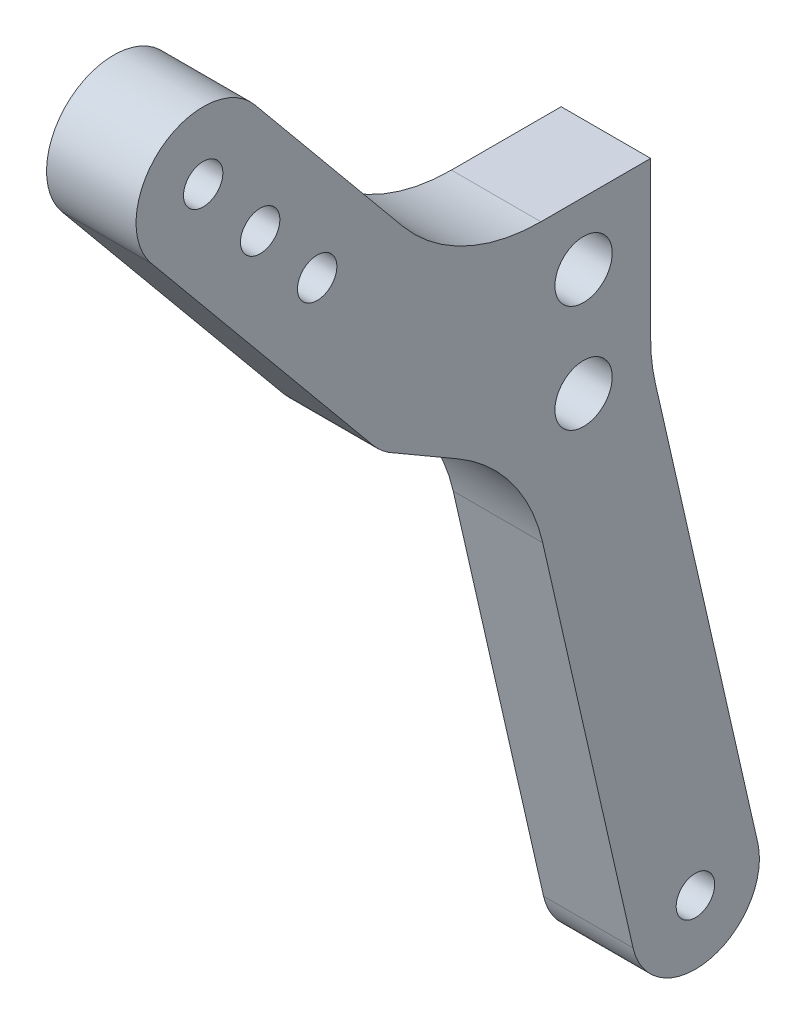
ISO-10303-21;
HEADER;
FILE_DESCRIPTION(('STEP AP214'),'2;1');
FILE_NAME('part.step','',(''),(''),'','','');
FILE_SCHEMA(('AUTOMOTIVE_DESIGN { 1 0 10303 214 1 1 1 1 }'));
ENDSEC;
DATA;
#1=APPLICATION_CONTEXT('core data for automotive mechanical design processes');
#2=APPLICATION_PROTOCOL_DEFINITION('international standard','automotive_design',2000,#1);
#3=PRODUCT_CONTEXT('',#1,'mechanical');
#4=PRODUCT('Part','Part','',(#3));
#5=PRODUCT_RELATED_PRODUCT_CATEGORY('part','',(#4));
#6=PRODUCT_DEFINITION_FORMATION('','',#4);
#7=PRODUCT_DEFINITION_CONTEXT('part definition',#1,'design');
#8=PRODUCT_DEFINITION('design','',#6,#7);
#9=PRODUCT_DEFINITION_SHAPE('','',#8);
#10=(LENGTH_UNIT() NAMED_UNIT(*) SI_UNIT(.MILLI.,.METRE.));
#11=(NAMED_UNIT(*) PLANE_ANGLE_UNIT() SI_UNIT($,.RADIAN.));
#12=(NAMED_UNIT(*) SI_UNIT($,.STERADIAN.) SOLID_ANGLE_UNIT());
#13=UNCERTAINTY_MEASURE_WITH_UNIT(LENGTH_MEASURE(1.E-05),#10,'distance_accuracy_value','');
#14=(GEOMETRIC_REPRESENTATION_CONTEXT(3) GLOBAL_UNCERTAINTY_ASSIGNED_CONTEXT((#13)) GLOBAL_UNIT_ASSIGNED_CONTEXT((#10,
#11,#12)) REPRESENTATION_CONTEXT('',''));
#15=CARTESIAN_POINT('',(0.,0.,0.));
#16=DIRECTION('',(0.,0.,1.));
#17=DIRECTION('',(1.,0.,0.));
#18=AXIS2_PLACEMENT_3D('',#15,#16,#17);
#19=CARTESIAN_POINT('',(-32.5307226607845,0.,12.6104473773552));
#20=DIRECTION('',(1.,0.,0.));
#21=DIRECTION('',(0.,0.,-1.));
#22=AXIS2_PLACEMENT_3D('',#19,#20,#21);
#23=CYLINDRICAL_SURFACE('',#22,3.75);
#24=CARTESIAN_POINT('',(-2.5,0.,12.6104473773552));
#25=DIRECTION('',(1.,0.,0.));
#26=DIRECTION('',(0.,0.,-1.));
#27=AXIS2_PLACEMENT_3D('',#24,#25,#26);
#28=CIRCLE('',#27,3.75);
#29=CARTESIAN_POINT('',(-2.5,-3.30477981303908,14.3827143965511));
#30=VERTEX_POINT('',#29);
#31=CARTESIAN_POINT('',(-2.5,-2.38810472879538,15.5017197277756));
#32=VERTEX_POINT('',#31);
#33=EDGE_CURVE('E205',#30,#32,#28,.F.);
#34=ORIENTED_EDGE('',*,*,#33,.F.);
#35=DIRECTION('',(1.,0.,0.));
#36=VECTOR('',#35,1.);
#37=CARTESIAN_POINT('',(-17.8789757883041,-3.30477981303908,14.3827143965511));
#38=LINE('',#37,#36);
#39=CARTESIAN_POINT('',(2.5,-3.30477981303908,14.3827143965511));
#40=VERTEX_POINT('',#39);
#41=EDGE_CURVE('E168',#30,#40,#38,.T.);
#42=ORIENTED_EDGE('',*,*,#41,.T.);
#43=CARTESIAN_POINT('',(2.5,0.,12.6104473773552));
#44=DIRECTION('',(1.,0.,0.));
#45=DIRECTION('',(0.,0.,-1.));
#46=AXIS2_PLACEMENT_3D('',#43,#44,#45);
#47=CIRCLE('',#46,3.75);
#48=CARTESIAN_POINT('',(2.5,-2.38810472879538,15.5017197277756));
#49=VERTEX_POINT('',#48);
#50=EDGE_CURVE('E196',#49,#40,#47,.T.);
#51=ORIENTED_EDGE('',*,*,#50,.F.);
#52=DIRECTION('',(1.,0.,0.));
#53=VECTOR('',#52,1.);
#54=CARTESIAN_POINT('',(-32.5307226607845,-2.38810472879538,15.5017197277756));
#55=LINE('',#54,#53);
#56=EDGE_CURVE('E202',#32,#49,#55,.T.);
#57=ORIENTED_EDGE('',*,*,#56,.F.);
#58=EDGE_LOOP('',(#34,#42,#51,#57));
#59=FACE_BOUND('',#58,.T.);
#60=ADVANCED_FACE('F33',(#59),#23,.T.);
#61=CARTESIAN_POINT('',(2.5,-3.75,13.));
#62=DIRECTION('',(-1.,0.,0.));
#63=DIRECTION('',(0.,0.,1.));
#64=AXIS2_PLACEMENT_3D('',#61,#62,#63);
#65=PLANE('',#64);
#66=DIRECTION('',(0.,0.974975634519117,0.222311745290359));
#67=VECTOR('',#66,1.);
#68=CARTESIAN_POINT('',(2.5,-32.3653829492016,-5.98553789340585));
#69=LINE('',#68,#67);
#70=CARTESIAN_POINT('',(2.5,-32.3653829492016,-5.98553789340585));
#71=VERTEX_POINT('',#70);
#72=CARTESIAN_POINT('',(2.5,-7.21254123979658,-0.250243654808829));
#73=VERTEX_POINT('',#72);
#74=EDGE_CURVE('E141',#71,#73,#69,.T.);
#75=ORIENTED_EDGE('',*,*,#74,.T.);
#76=CARTESIAN_POINT('',(2.5,-4.98942378689299,-10.));
#77=DIRECTION('',(-1.,0.,0.));
#78=DIRECTION('',(0.,0.,1.));
#79=AXIS2_PLACEMENT_3D('',#76,#77,#78);
#80=CIRCLE('',#79,10.);
#81=CARTESIAN_POINT('',(2.5,-4.98942378689299,0.));
#82=VERTEX_POINT('',#81);
#83=EDGE_CURVE('E41',#73,#82,#80,.T.);
#84=ORIENTED_EDGE('',*,*,#83,.T.);
#85=DIRECTION('',(0.,1.,0.));
#86=VECTOR('',#85,1.);
#87=CARTESIAN_POINT('',(2.5,-3.75,0.));
#88=LINE('',#87,#86);
#89=CARTESIAN_POINT('',(2.5,3.75,0.));
#90=VERTEX_POINT('',#89);
#91=EDGE_CURVE('E226',#82,#90,#88,.T.);
#92=ORIENTED_EDGE('',*,*,#91,.T.);
#93=DIRECTION('',(0.,0.,-1.));
#94=VECTOR('',#93,1.);
#95=CARTESIAN_POINT('',(2.5,3.75,13.));
#96=LINE('',#95,#94);
#97=CARTESIAN_POINT('',(2.5,3.75,6.13369330182128));
#98=VERTEX_POINT('',#97);
#99=EDGE_CURVE('E235',#98,#90,#96,.T.);
#100=ORIENTED_EDGE('',*,*,#99,.F.);
#101=CARTESIAN_POINT('',(2.5,13.75,6.13369330182128));
#102=DIRECTION('',(-1.,0.,0.));
#103=DIRECTION('',(0.,0.,1.));
#104=AXIS2_PLACEMENT_3D('',#101,#102,#103);
#105=CIRCLE('',#104,10.);
#106=CARTESIAN_POINT('',(2.5,7.38172072321232,13.8437529029422));
#107=VERTEX_POINT('',#106);
#108=EDGE_CURVE('E254',#98,#107,#105,.T.);
#109=ORIENTED_EDGE('',*,*,#108,.T.);
#110=DIRECTION('',(0.,0.771005960112091,0.636827927678767));
#111=VECTOR('',#110,1.);
#112=CARTESIAN_POINT('',(2.5,2.38810472879537,9.71917502693489));
#113=LINE('',#112,#111);
#114=CARTESIAN_POINT('',(2.5,17.3881047287954,22.1087276495797));
#115=VERTEX_POINT('',#114);
#116=EDGE_CURVE('E210',#107,#115,#113,.T.);
#117=ORIENTED_EDGE('',*,*,#116,.T.);
#118=CARTESIAN_POINT('',(2.5,15.,25.));
#119=DIRECTION('',(1.,0.,0.));
#120=DIRECTION('',(0.,0.,-1.));
#121=AXIS2_PLACEMENT_3D('',#118,#119,#120);
#122=CIRCLE('',#121,3.75);
#123=CARTESIAN_POINT('',(2.5,12.6118952712046,27.8912723504203));
#124=VERTEX_POINT('',#123);
#125=EDGE_CURVE('E212',#115,#124,#122,.T.);
#126=ORIENTED_EDGE('',*,*,#125,.T.);
#127=DIRECTION('',(0.,0.771005960112091,0.636827927678767));
#128=VECTOR('',#127,1.);
#129=CARTESIAN_POINT('',(2.5,-2.38810472879538,15.5017197277756));
#130=LINE('',#129,#128);
#131=EDGE_CURVE('E215',#49,#124,#130,.T.);
#132=ORIENTED_EDGE('',*,*,#131,.F.);
#133=ORIENTED_EDGE('',*,*,#50,.T.);
#134=DIRECTION('',(0.,0.501941959665057,0.864901306004102));
#135=VECTOR('',#134,1.);
#136=CARTESIAN_POINT('',(2.5,-8.75,5.));
#137=LINE('',#136,#135);
#138=CARTESIAN_POINT('',(2.5,-5.40718089693601,10.7600456632571));
#139=VERTEX_POINT('',#138);
#140=EDGE_CURVE('E162',#139,#40,#137,.T.);
#141=ORIENTED_EDGE('',*,*,#140,.F.);
#142=CARTESIAN_POINT('',(2.5,-14.056193956977,15.7794652599077));
#143=DIRECTION('',(-1.,0.,0.));
#144=DIRECTION('',(0.,0.,1.));
#145=AXIS2_PLACEMENT_3D('',#142,#143,#144);
#146=CIRCLE('',#145,10.);
#147=CARTESIAN_POINT('',(2.5,-11.8330765040735,6.02970891471654));
#148=VERTEX_POINT('',#147);
#149=EDGE_CURVE('E250',#139,#148,#146,.T.);
#150=ORIENTED_EDGE('',*,*,#149,.T.);
#151=DIRECTION('',(0.,-0.974975634519117,-0.222311745290359));
#152=VECTOR('',#151,1.);
#153=CARTESIAN_POINT('',(2.5,-33.9549119280277,0.985537893405839));
#154=LINE('',#153,#152);
#155=CARTESIAN_POINT('',(2.5,-33.9549119280277,0.985537893405839));
#156=VERTEX_POINT('',#155);
#157=EDGE_CURVE('E138',#148,#156,#154,.T.);
#158=ORIENTED_EDGE('',*,*,#157,.T.);
#159=CARTESIAN_POINT('',(2.5,-33.1601474386147,-2.50000000000001));
#160=DIRECTION('',(1.,0.,0.));
#161=DIRECTION('',(0.,0.,-1.));
#162=AXIS2_PLACEMENT_3D('',#159,#160,#161);
#163=CIRCLE('',#162,3.575);
#164=EDGE_CURVE('E133',#156,#71,#163,.T.);
#165=ORIENTED_EDGE('',*,*,#164,.T.);
#166=EDGE_LOOP('',(#75,#84,#92,#100,#109,#117,#126,#132,#133,#141,#150,#158,#165));
#167=FACE_BOUND('',#166,.T.);
#168=CARTESIAN_POINT('',(2.5,15.,25.));
#169=DIRECTION('',(1.,0.,0.));
#170=DIRECTION('',(0.,0.,-1.));
#171=AXIS2_PLACEMENT_3D('',#168,#169,#170);
#172=CIRCLE('',#171,1.1);
#173=CARTESIAN_POINT('',(2.5,15.,23.9));
#174=VERTEX_POINT('',#173);
#175=EDGE_CURVE('E190',#174,#174,#172,.T.);
#176=ORIENTED_EDGE('',*,*,#175,.F.);
#177=EDGE_LOOP('',(#176));
#178=FACE_BOUND('',#177,.T.);
#179=CARTESIAN_POINT('',(2.5,11.1449701994395,21.8158603616062));
#180=DIRECTION('',(1.,0.,0.));
#181=DIRECTION('',(0.,0.,-1.));
#182=AXIS2_PLACEMENT_3D('',#179,#180,#181);
#183=CIRCLE('',#182,1.1);
#184=CARTESIAN_POINT('',(2.5,11.1449701994395,20.7158603616062));
#185=VERTEX_POINT('',#184);
#186=EDGE_CURVE('E184',#185,#185,#183,.T.);
#187=ORIENTED_EDGE('',*,*,#186,.F.);
#188=EDGE_LOOP('',(#187));
#189=FACE_BOUND('',#188,.T.);
#190=CARTESIAN_POINT('',(2.5,7.28994039887909,18.6317207232123));
#191=DIRECTION('',(1.,0.,0.));
#192=DIRECTION('',(0.,0.,-1.));
#193=AXIS2_PLACEMENT_3D('',#190,#191,#192);
#194=CIRCLE('',#193,1.1);
#195=CARTESIAN_POINT('',(2.5,7.28994039887909,17.5317207232123));
#196=VERTEX_POINT('',#195);
#197=EDGE_CURVE('E178',#196,#196,#194,.T.);
#198=ORIENTED_EDGE('',*,*,#197,.F.);
#199=EDGE_LOOP('',(#198));
#200=FACE_BOUND('',#199,.T.);
#201=CARTESIAN_POINT('',(2.5,0.249999999999999,3.74999999999999));
#202=DIRECTION('',(1.,0.,0.));
#203=DIRECTION('',(0.,0.,-1.));
#204=AXIS2_PLACEMENT_3D('',#201,#202,#203);
#205=CIRCLE('',#204,1.6);
#206=CARTESIAN_POINT('',(2.5,0.249999999999999,2.14999999999999));
#207=VERTEX_POINT('',#206);
#208=EDGE_CURVE('E174',#207,#207,#205,.T.);
#209=ORIENTED_EDGE('',*,*,#208,.F.);
#210=EDGE_LOOP('',(#209));
#211=FACE_BOUND('',#210,.T.);
#212=CARTESIAN_POINT('',(2.5,-5.75,3.74999999999999));
#213=DIRECTION('',(1.,0.,0.));
#214=DIRECTION('',(0.,0.,-1.));
#215=AXIS2_PLACEMENT_3D('',#212,#213,#214);
#216=CIRCLE('',#215,1.6);
#217=CARTESIAN_POINT('',(2.5,-5.75,2.14999999999999));
#218=VERTEX_POINT('',#217);
#219=EDGE_CURVE('E163',#218,#218,#216,.T.);
#220=ORIENTED_EDGE('',*,*,#219,.F.);
#221=EDGE_LOOP('',(#220));
#222=FACE_BOUND('',#221,.T.);
#223=CARTESIAN_POINT('',(2.5,-33.1601474386147,-2.50000000000001));
#224=DIRECTION('',(1.,0.,0.));
#225=DIRECTION('',(0.,0.,-1.));
#226=AXIS2_PLACEMENT_3D('',#223,#224,#225);
#227=CIRCLE('',#226,1.075);
#228=CARTESIAN_POINT('',(2.5,-33.1601474386147,-3.57500000000001));
#229=VERTEX_POINT('',#228);
#230=EDGE_CURVE('E150',#229,#229,#227,.T.);
#231=ORIENTED_EDGE('',*,*,#230,.F.);
#232=EDGE_LOOP('',(#231));
#233=FACE_BOUND('',#232,.T.);
#234=ADVANCED_FACE('F146',(#167,#178,#189,#200,#211,#222,#233),#65,.F.);
#235=CARTESIAN_POINT('',(-2.5,3.75,13.));
#236=DIRECTION('',(0.,-1.,0.));
#237=DIRECTION('',(0.,0.,-1.));
#238=AXIS2_PLACEMENT_3D('',#235,#236,#237);
#239=PLANE('',#238);
#240=DIRECTION('',(0.,0.,-1.));
#241=VECTOR('',#240,1.);
#242=CARTESIAN_POINT('',(-2.5,3.75,13.));
#243=LINE('',#242,#241);
#244=CARTESIAN_POINT('',(-2.5,3.75,6.13369330182128));
#245=VERTEX_POINT('',#244);
#246=CARTESIAN_POINT('',(-2.5,3.75,0.));
#247=VERTEX_POINT('',#246);
#248=EDGE_CURVE('E233',#245,#247,#243,.T.);
#249=ORIENTED_EDGE('',*,*,#248,.F.);
#250=DIRECTION('',(1.,0.,0.));
#251=VECTOR('',#250,1.);
#252=CARTESIAN_POINT('',(-2.5,3.75,6.13369330182128));
#253=LINE('',#252,#251);
#254=EDGE_CURVE('E243',#245,#98,#253,.T.);
#255=ORIENTED_EDGE('',*,*,#254,.T.);
#256=ORIENTED_EDGE('',*,*,#99,.T.);
#257=DIRECTION('',(-1.,0.,0.));
#258=VECTOR('',#257,1.);
#259=CARTESIAN_POINT('',(-2.5,3.75,0.));
#260=LINE('',#259,#258);
#261=EDGE_CURVE('E228',#90,#247,#260,.T.);
#262=ORIENTED_EDGE('',*,*,#261,.T.);
#263=EDGE_LOOP('',(#249,#255,#256,#262));
#264=FACE_BOUND('',#263,.T.);
#265=ADVANCED_FACE('F267',(#264),#239,.F.);
#266=CARTESIAN_POINT('',(-2.5,-3.75,13.));
#267=DIRECTION('',(1.,0.,0.));
#268=DIRECTION('',(0.,0.,-1.));
#269=AXIS2_PLACEMENT_3D('',#266,#267,#268);
#270=PLANE('',#269);
#271=DIRECTION('',(0.,-1.,0.));
#272=VECTOR('',#271,1.);
#273=CARTESIAN_POINT('',(-2.5,-3.75,0.));
#274=LINE('',#273,#272);
#275=CARTESIAN_POINT('',(-2.5,-4.98942378689299,0.));
#276=VERTEX_POINT('',#275);
#277=EDGE_CURVE('E231',#247,#276,#274,.T.);
#278=ORIENTED_EDGE('',*,*,#277,.T.);
#279=CARTESIAN_POINT('',(-2.50000000000001,-4.98942378689299,-10.));
#280=DIRECTION('',(1.,0.,0.));
#281=DIRECTION('',(0.,0.,-1.));
#282=AXIS2_PLACEMENT_3D('',#279,#280,#281);
#283=CIRCLE('',#282,10.);
#284=CARTESIAN_POINT('',(-2.5,-7.21254123979658,-0.25024365480883));
#285=VERTEX_POINT('',#284);
#286=EDGE_CURVE('E11',#276,#285,#283,.T.);
#287=ORIENTED_EDGE('',*,*,#286,.T.);
#288=DIRECTION('',(0.,-0.974975634519117,-0.222311745290359));
#289=VECTOR('',#288,1.);
#290=CARTESIAN_POINT('',(-2.5,-32.3653829492016,-5.98553789340585));
#291=LINE('',#290,#289);
#292=CARTESIAN_POINT('',(-2.5,-32.3653829492016,-5.98553789340585));
#293=VERTEX_POINT('',#292);
#294=EDGE_CURVE('E300',#285,#293,#291,.T.);
#295=ORIENTED_EDGE('',*,*,#294,.T.);
#296=CARTESIAN_POINT('',(-2.5,-33.1601474386147,-2.50000000000001));
#297=DIRECTION('',(1.,0.,0.));
#298=DIRECTION('',(0.,0.,-1.));
#299=AXIS2_PLACEMENT_3D('',#296,#297,#298);
#300=CIRCLE('',#299,3.575);
#301=CARTESIAN_POINT('',(-2.5,-33.9549119280277,0.985537893405839));
#302=VERTEX_POINT('',#301);
#303=EDGE_CURVE('E134',#293,#302,#300,.F.);
#304=ORIENTED_EDGE('',*,*,#303,.T.);
#305=DIRECTION('',(0.,0.974975634519117,0.222311745290359));
#306=VECTOR('',#305,1.);
#307=CARTESIAN_POINT('',(-2.5,-33.9549119280277,0.985537893405839));
#308=LINE('',#307,#306);
#309=CARTESIAN_POINT('',(-2.5,-11.8330765040734,6.02970891471655));
#310=VERTEX_POINT('',#309);
#311=EDGE_CURVE('E157',#302,#310,#308,.T.);
#312=ORIENTED_EDGE('',*,*,#311,.T.);
#313=CARTESIAN_POINT('',(-2.5,-14.056193956977,15.7794652599077));
#314=DIRECTION('',(1.,0.,0.));
#315=DIRECTION('',(0.,0.,-1.));
#316=AXIS2_PLACEMENT_3D('',#313,#314,#315);
#317=CIRCLE('',#316,10.);
#318=CARTESIAN_POINT('',(-2.5,-5.40718089693601,10.7600456632571));
#319=VERTEX_POINT('',#318);
#320=EDGE_CURVE('E252',#310,#319,#317,.T.);
#321=ORIENTED_EDGE('',*,*,#320,.T.);
#322=DIRECTION('',(0.,-0.501941959665057,-0.864901306004103));
#323=VECTOR('',#322,1.);
#324=CARTESIAN_POINT('',(-2.5,-8.75,5.));
#325=LINE('',#324,#323);
#326=EDGE_CURVE('E171',#30,#319,#325,.T.);
#327=ORIENTED_EDGE('',*,*,#326,.F.);
#328=ORIENTED_EDGE('',*,*,#33,.T.);
#329=DIRECTION('',(0.,-0.771005960112091,-0.636827927678767));
#330=VECTOR('',#329,1.);
#331=CARTESIAN_POINT('',(-2.5,-2.38810472879538,15.5017197277756));
#332=LINE('',#331,#330);
#333=CARTESIAN_POINT('',(-2.5,12.6118952712046,27.8912723504203));
#334=VERTEX_POINT('',#333);
#335=EDGE_CURVE('E201',#334,#32,#332,.T.);
#336=ORIENTED_EDGE('',*,*,#335,.F.);
#337=CARTESIAN_POINT('',(-2.5,15.,25.));
#338=DIRECTION('',(1.,0.,0.));
#339=DIRECTION('',(0.,0.,-1.));
#340=AXIS2_PLACEMENT_3D('',#337,#338,#339);
#341=CIRCLE('',#340,3.75);
#342=CARTESIAN_POINT('',(-2.5,17.3881047287954,22.1087276495797));
#343=VERTEX_POINT('',#342);
#344=EDGE_CURVE('E199',#334,#343,#341,.F.);
#345=ORIENTED_EDGE('',*,*,#344,.T.);
#346=DIRECTION('',(0.,-0.771005960112091,-0.636827927678767));
#347=VECTOR('',#346,1.);
#348=CARTESIAN_POINT('',(-2.5,2.38810472879537,9.71917502693489));
#349=LINE('',#348,#347);
#350=CARTESIAN_POINT('',(-2.5,7.38172072321233,13.8437529029422));
#351=VERTEX_POINT('',#350);
#352=EDGE_CURVE('E207',#343,#351,#349,.T.);
#353=ORIENTED_EDGE('',*,*,#352,.T.);
#354=CARTESIAN_POINT('',(-2.5,13.75,6.13369330182128));
#355=DIRECTION('',(1.,0.,0.));
#356=DIRECTION('',(0.,0.,-1.));
#357=AXIS2_PLACEMENT_3D('',#354,#355,#356);
#358=CIRCLE('',#357,10.);
#359=EDGE_CURVE('E256',#351,#245,#358,.T.);
#360=ORIENTED_EDGE('',*,*,#359,.T.);
#361=ORIENTED_EDGE('',*,*,#248,.T.);
#362=EDGE_LOOP('',(#278,#287,#295,#304,#312,#321,#327,#328,#336,#345,#353,#360,#361));
#363=FACE_BOUND('',#362,.T.);
#364=CARTESIAN_POINT('',(-2.5,15.,25.));
#365=DIRECTION('',(1.,0.,0.));
#366=DIRECTION('',(0.,0.,-1.));
#367=AXIS2_PLACEMENT_3D('',#364,#365,#366);
#368=CIRCLE('',#367,1.1);
#369=CARTESIAN_POINT('',(-2.5,15.,23.9));
#370=VERTEX_POINT('',#369);
#371=EDGE_CURVE('E193',#370,#370,#368,.T.);
#372=ORIENTED_EDGE('',*,*,#371,.T.);
#373=EDGE_LOOP('',(#372));
#374=FACE_BOUND('',#373,.T.);
#375=CARTESIAN_POINT('',(-2.5,11.1449701994395,21.8158603616062));
#376=DIRECTION('',(1.,0.,0.));
#377=DIRECTION('',(0.,0.,-1.));
#378=AXIS2_PLACEMENT_3D('',#375,#376,#377);
#379=CIRCLE('',#378,1.1);
#380=CARTESIAN_POINT('',(-2.5,11.1449701994395,20.7158603616062));
#381=VERTEX_POINT('',#380);
#382=EDGE_CURVE('E187',#381,#381,#379,.T.);
#383=ORIENTED_EDGE('',*,*,#382,.T.);
#384=EDGE_LOOP('',(#383));
#385=FACE_BOUND('',#384,.T.);
#386=CARTESIAN_POINT('',(-2.5,7.28994039887909,18.6317207232123));
#387=DIRECTION('',(1.,0.,0.));
#388=DIRECTION('',(0.,0.,-1.));
#389=AXIS2_PLACEMENT_3D('',#386,#387,#388);
#390=CIRCLE('',#389,1.1);
#391=CARTESIAN_POINT('',(-2.5,7.28994039887909,17.5317207232123));
#392=VERTEX_POINT('',#391);
#393=EDGE_CURVE('E181',#392,#392,#390,.T.);
#394=ORIENTED_EDGE('',*,*,#393,.T.);
#395=EDGE_LOOP('',(#394));
#396=FACE_BOUND('',#395,.T.);
#397=CARTESIAN_POINT('',(-2.5,0.249999999999999,3.74999999999999));
#398=DIRECTION('',(1.,0.,0.));
#399=DIRECTION('',(0.,0.,-1.));
#400=AXIS2_PLACEMENT_3D('',#397,#398,#399);
#401=CIRCLE('',#400,1.6);
#402=CARTESIAN_POINT('',(-2.5,0.249999999999999,2.14999999999999));
#403=VERTEX_POINT('',#402);
#404=EDGE_CURVE('E175',#403,#403,#401,.T.);
#405=ORIENTED_EDGE('',*,*,#404,.T.);
#406=EDGE_LOOP('',(#405));
#407=FACE_BOUND('',#406,.T.);
#408=CARTESIAN_POINT('',(-2.5,-5.75,3.74999999999999));
#409=DIRECTION('',(1.,0.,0.));
#410=DIRECTION('',(0.,0.,-1.));
#411=AXIS2_PLACEMENT_3D('',#408,#409,#410);
#412=CIRCLE('',#411,1.6);
#413=CARTESIAN_POINT('',(-2.5,-5.75,2.14999999999999));
#414=VERTEX_POINT('',#413);
#415=EDGE_CURVE('E159',#414,#414,#412,.T.);
#416=ORIENTED_EDGE('',*,*,#415,.T.);
#417=EDGE_LOOP('',(#416));
#418=FACE_BOUND('',#417,.T.);
#419=CARTESIAN_POINT('',(-2.5,-33.1601474386147,-2.50000000000001));
#420=DIRECTION('',(1.,0.,0.));
#421=DIRECTION('',(0.,0.,-1.));
#422=AXIS2_PLACEMENT_3D('',#419,#420,#421);
#423=CIRCLE('',#422,1.075);
#424=CARTESIAN_POINT('',(-2.5,-33.1601474386147,-3.57500000000001));
#425=VERTEX_POINT('',#424);
#426=EDGE_CURVE('E166',#425,#425,#423,.F.);
#427=ORIENTED_EDGE('',*,*,#426,.F.);
#428=EDGE_LOOP('',(#427));
#429=FACE_BOUND('',#428,.T.);
#430=ADVANCED_FACE('F260',(#363,#374,#385,#396,#407,#418,#429),#270,.F.);
#431=CARTESIAN_POINT('',(0.,0.,0.));
#432=DIRECTION('',(0.,0.,-1.));
#433=DIRECTION('',(-1.,0.,0.));
#434=AXIS2_PLACEMENT_3D('',#431,#432,#433);
#435=PLANE('',#434);
#436=ORIENTED_EDGE('',*,*,#91,.F.);
#437=DIRECTION('',(1.,0.,0.));
#438=VECTOR('',#437,1.);
#439=CARTESIAN_POINT('',(-2.50000000000002,-4.98942378689299,0.));
#440=LINE('',#439,#438);
#441=EDGE_CURVE('E54',#82,#276,#440,.F.);
#442=ORIENTED_EDGE('',*,*,#441,.T.);
#443=ORIENTED_EDGE('',*,*,#277,.F.);
#444=ORIENTED_EDGE('',*,*,#261,.F.);
#445=EDGE_LOOP('',(#436,#442,#443,#444));
#446=FACE_BOUND('',#445,.T.);
#447=ADVANCED_FACE('F310',(#446),#435,.T.);
#448=CARTESIAN_POINT('',(-32.5307226607845,2.38810472879537,9.71917502693489));
#449=DIRECTION('',(0.,0.636827927678767,-0.771005960112091));
#450=DIRECTION('',(0.,0.771005960112091,0.636827927678767));
#451=AXIS2_PLACEMENT_3D('',#448,#449,#450);
#452=PLANE('',#451);
#453=ORIENTED_EDGE('',*,*,#116,.F.);
#454=DIRECTION('',(1.,0.,0.));
#455=VECTOR('',#454,1.);
#456=CARTESIAN_POINT('',(-32.5307226607845,7.38172072321233,13.8437529029422));
#457=LINE('',#456,#455);
#458=EDGE_CURVE('E246',#107,#351,#457,.F.);
#459=ORIENTED_EDGE('',*,*,#458,.T.);
#460=ORIENTED_EDGE('',*,*,#352,.F.);
#461=DIRECTION('',(1.,0.,0.));
#462=VECTOR('',#461,1.);
#463=CARTESIAN_POINT('',(-32.5307226607845,17.3881047287954,22.1087276495797));
#464=LINE('',#463,#462);
#465=EDGE_CURVE('E218',#343,#115,#464,.T.);
#466=ORIENTED_EDGE('',*,*,#465,.T.);
#467=EDGE_LOOP('',(#453,#459,#460,#466));
#468=FACE_BOUND('',#467,.T.);
#469=ADVANCED_FACE('F273',(#468),#452,.T.);
#470=CARTESIAN_POINT('',(-32.5307226607845,-2.38810472879538,15.5017197277756));
#471=DIRECTION('',(0.,0.636827927678767,-0.771005960112091));
#472=DIRECTION('',(0.,0.771005960112091,0.636827927678767));
#473=AXIS2_PLACEMENT_3D('',#470,#471,#472);
#474=PLANE('',#473);
#475=DIRECTION('',(1.,0.,0.));
#476=VECTOR('',#475,1.);
#477=CARTESIAN_POINT('',(-32.5307226607845,12.6118952712046,27.8912723504203));
#478=LINE('',#477,#476);
#479=EDGE_CURVE('E220',#334,#124,#478,.T.);
#480=ORIENTED_EDGE('',*,*,#479,.F.);
#481=ORIENTED_EDGE('',*,*,#335,.T.);
#482=ORIENTED_EDGE('',*,*,#56,.T.);
#483=ORIENTED_EDGE('',*,*,#131,.T.);
#484=EDGE_LOOP('',(#480,#481,#482,#483));
#485=FACE_BOUND('',#484,.T.);
#486=ADVANCED_FACE('F327',(#485),#474,.F.);
#487=CARTESIAN_POINT('',(-32.5307226607845,15.,25.));
#488=DIRECTION('',(1.,0.,0.));
#489=DIRECTION('',(0.,0.,-1.));
#490=AXIS2_PLACEMENT_3D('',#487,#488,#489);
#491=CYLINDRICAL_SURFACE('',#490,3.75);
#492=ORIENTED_EDGE('',*,*,#344,.F.);
#493=ORIENTED_EDGE('',*,*,#479,.T.);
#494=ORIENTED_EDGE('',*,*,#125,.F.);
#495=ORIENTED_EDGE('',*,*,#465,.F.);
#496=EDGE_LOOP('',(#492,#493,#494,#495));
#497=FACE_BOUND('',#496,.T.);
#498=ADVANCED_FACE('F278',(#497),#491,.T.);
#499=CARTESIAN_POINT('',(-2.5,15.,25.));
#500=DIRECTION('',(1.,0.,0.));
#501=DIRECTION('',(0.,0.,-1.));
#502=AXIS2_PLACEMENT_3D('',#499,#500,#501);
#503=CYLINDRICAL_SURFACE('',#502,1.1);
#504=ORIENTED_EDGE('',*,*,#371,.F.);
#505=EDGE_LOOP('',(#504));
#506=FACE_BOUND('',#505,.T.);
#507=ORIENTED_EDGE('',*,*,#175,.T.);
#508=EDGE_LOOP('',(#507));
#509=FACE_BOUND('',#508,.T.);
#510=ADVANCED_FACE('F330',(#506,#509),#503,.F.);
#511=CARTESIAN_POINT('',(-2.5,11.1449701994395,21.8158603616062));
#512=DIRECTION('',(1.,0.,0.));
#513=DIRECTION('',(0.,0.,-1.));
#514=AXIS2_PLACEMENT_3D('',#511,#512,#513);
#515=CYLINDRICAL_SURFACE('',#514,1.1);
#516=ORIENTED_EDGE('',*,*,#382,.F.);
#517=EDGE_LOOP('',(#516));
#518=FACE_BOUND('',#517,.T.);
#519=ORIENTED_EDGE('',*,*,#186,.T.);
#520=EDGE_LOOP('',(#519));
#521=FACE_BOUND('',#520,.T.);
#522=ADVANCED_FACE('F335',(#518,#521),#515,.F.);
#523=CARTESIAN_POINT('',(-2.5,7.28994039887909,18.6317207232123));
#524=DIRECTION('',(1.,0.,0.));
#525=DIRECTION('',(0.,0.,-1.));
#526=AXIS2_PLACEMENT_3D('',#523,#524,#525);
#527=CYLINDRICAL_SURFACE('',#526,1.1);
#528=ORIENTED_EDGE('',*,*,#393,.F.);
#529=EDGE_LOOP('',(#528));
#530=FACE_BOUND('',#529,.T.);
#531=ORIENTED_EDGE('',*,*,#197,.T.);
#532=EDGE_LOOP('',(#531));
#533=FACE_BOUND('',#532,.T.);
#534=ADVANCED_FACE('F339',(#530,#533),#527,.F.);
#535=CARTESIAN_POINT('',(-2.5,0.249999999999999,3.74999999999999));
#536=DIRECTION('',(1.,0.,0.));
#537=DIRECTION('',(0.,0.,-1.));
#538=AXIS2_PLACEMENT_3D('',#535,#536,#537);
#539=CYLINDRICAL_SURFACE('',#538,1.6);
#540=ORIENTED_EDGE('',*,*,#404,.F.);
#541=EDGE_LOOP('',(#540));
#542=FACE_BOUND('',#541,.T.);
#543=ORIENTED_EDGE('',*,*,#208,.T.);
#544=EDGE_LOOP('',(#543));
#545=FACE_BOUND('',#544,.T.);
#546=ADVANCED_FACE('F343',(#542,#545),#539,.F.);
#547=CARTESIAN_POINT('',(-17.8789757883041,-8.75,5.));
#548=DIRECTION('',(0.,0.864901306004102,-0.501941959665057));
#549=DIRECTION('',(0.,0.501941959665057,0.864901306004103));
#550=AXIS2_PLACEMENT_3D('',#547,#548,#549);
#551=PLANE('',#550);
#552=ORIENTED_EDGE('',*,*,#326,.T.);
#553=DIRECTION('',(1.,0.,0.));
#554=VECTOR('',#553,1.);
#555=CARTESIAN_POINT('',(-17.8789757883041,-5.40718089693601,10.7600456632571));
#556=LINE('',#555,#554);
#557=EDGE_CURVE('E238',#319,#139,#556,.T.);
#558=ORIENTED_EDGE('',*,*,#557,.T.);
#559=ORIENTED_EDGE('',*,*,#140,.T.);
#560=ORIENTED_EDGE('',*,*,#41,.F.);
#561=EDGE_LOOP('',(#552,#558,#559,#560));
#562=FACE_BOUND('',#561,.T.);
#563=ADVANCED_FACE('F289',(#562),#551,.F.);
#564=CARTESIAN_POINT('',(-2.5,-5.75,3.74999999999999));
#565=DIRECTION('',(1.,0.,0.));
#566=DIRECTION('',(0.,0.,-1.));
#567=AXIS2_PLACEMENT_3D('',#564,#565,#566);
#568=CYLINDRICAL_SURFACE('',#567,1.6);
#569=ORIENTED_EDGE('',*,*,#415,.F.);
#570=EDGE_LOOP('',(#569));
#571=FACE_BOUND('',#570,.T.);
#572=ORIENTED_EDGE('',*,*,#219,.T.);
#573=EDGE_LOOP('',(#572));
#574=FACE_BOUND('',#573,.T.);
#575=ADVANCED_FACE('F350',(#571,#574),#568,.F.);
#576=CARTESIAN_POINT('',(-39.5670175625013,-33.9549119280277,0.985537893405839));
#577=DIRECTION('',(0.,-0.222311745290359,0.974975634519117));
#578=DIRECTION('',(0.,-0.974975634519117,-0.222311745290359));
#579=AXIS2_PLACEMENT_3D('',#576,#577,#578);
#580=PLANE('',#579);
#581=ORIENTED_EDGE('',*,*,#157,.F.);
#582=DIRECTION('',(1.,0.,0.));
#583=VECTOR('',#582,1.);
#584=CARTESIAN_POINT('',(-39.5670175625013,-11.8330765040735,6.02970891471655));
#585=LINE('',#584,#583);
#586=EDGE_CURVE('E241',#148,#310,#585,.F.);
#587=ORIENTED_EDGE('',*,*,#586,.T.);
#588=ORIENTED_EDGE('',*,*,#311,.F.);
#589=DIRECTION('',(1.,0.,0.));
#590=VECTOR('',#589,1.);
#591=CARTESIAN_POINT('',(-39.5670175625013,-33.9549119280277,0.985537893405839));
#592=LINE('',#591,#590);
#593=EDGE_CURVE('E137',#302,#156,#592,.T.);
#594=ORIENTED_EDGE('',*,*,#593,.T.);
#595=EDGE_LOOP('',(#581,#587,#588,#594));
#596=FACE_BOUND('',#595,.T.);
#597=ADVANCED_FACE('F298',(#596),#580,.T.);
#598=CARTESIAN_POINT('',(-39.5670175625013,-32.3653829492016,-5.98553789340585));
#599=DIRECTION('',(0.,0.222311745290359,-0.974975634519117));
#600=DIRECTION('',(0.,0.974975634519117,0.222311745290359));
#601=AXIS2_PLACEMENT_3D('',#598,#599,#600);
#602=PLANE('',#601);
#603=ORIENTED_EDGE('',*,*,#294,.F.);
#604=DIRECTION('',(1.,0.,0.));
#605=VECTOR('',#604,1.);
#606=CARTESIAN_POINT('',(2.49999999999999,-7.21254123979658,-0.25024365480883));
#607=LINE('',#606,#605);
#608=EDGE_CURVE('E144',#285,#73,#607,.T.);
#609=ORIENTED_EDGE('',*,*,#608,.T.);
#610=ORIENTED_EDGE('',*,*,#74,.F.);
#611=DIRECTION('',(1.,0.,0.));
#612=VECTOR('',#611,1.);
#613=CARTESIAN_POINT('',(-39.5670175625013,-32.3653829492016,-5.98553789340585));
#614=LINE('',#613,#612);
#615=EDGE_CURVE('E128',#293,#71,#614,.T.);
#616=ORIENTED_EDGE('',*,*,#615,.F.);
#617=EDGE_LOOP('',(#603,#609,#610,#616));
#618=FACE_BOUND('',#617,.T.);
#619=ADVANCED_FACE('F142',(#618),#602,.T.);
#620=CARTESIAN_POINT('',(-39.5670175625013,-33.1601474386147,-2.50000000000001));
#621=DIRECTION('',(1.,0.,0.));
#622=DIRECTION('',(0.,0.,-1.));
#623=AXIS2_PLACEMENT_3D('',#620,#621,#622);
#624=CYLINDRICAL_SURFACE('',#623,3.575);
#625=ORIENTED_EDGE('',*,*,#303,.F.);
#626=ORIENTED_EDGE('',*,*,#615,.T.);
#627=ORIENTED_EDGE('',*,*,#164,.F.);
#628=ORIENTED_EDGE('',*,*,#593,.F.);
#629=EDGE_LOOP('',(#625,#626,#627,#628));
#630=FACE_BOUND('',#629,.T.);
#631=ADVANCED_FACE('F130',(#630),#624,.T.);
#632=CARTESIAN_POINT('',(-39.5670175625013,-33.1601474386147,-2.50000000000001));
#633=DIRECTION('',(1.,0.,0.));
#634=DIRECTION('',(0.,0.,-1.));
#635=AXIS2_PLACEMENT_3D('',#632,#633,#634);
#636=CYLINDRICAL_SURFACE('',#635,1.075);
#637=ORIENTED_EDGE('',*,*,#426,.T.);
#638=EDGE_LOOP('',(#637));
#639=FACE_BOUND('',#638,.T.);
#640=ORIENTED_EDGE('',*,*,#230,.T.);
#641=EDGE_LOOP('',(#640));
#642=FACE_BOUND('',#641,.T.);
#643=ADVANCED_FACE('F306',(#639,#642),#636,.F.);
#644=CARTESIAN_POINT('',(-17.8789757883041,-14.056193956977,15.7794652599077));
#645=DIRECTION('',(1.,0.,0.));
#646=DIRECTION('',(0.,0.,-1.));
#647=AXIS2_PLACEMENT_3D('',#644,#645,#646);
#648=CYLINDRICAL_SURFACE('',#647,10.);
#649=ORIENTED_EDGE('',*,*,#320,.F.);
#650=ORIENTED_EDGE('',*,*,#586,.F.);
#651=ORIENTED_EDGE('',*,*,#149,.F.);
#652=ORIENTED_EDGE('',*,*,#557,.F.);
#653=EDGE_LOOP('',(#649,#650,#651,#652));
#654=FACE_BOUND('',#653,.T.);
#655=ADVANCED_FACE('F296',(#654),#648,.F.);
#656=CARTESIAN_POINT('',(-2.5,13.75,6.13369330182128));
#657=DIRECTION('',(1.,0.,0.));
#658=DIRECTION('',(0.,0.,-1.));
#659=AXIS2_PLACEMENT_3D('',#656,#657,#658);
#660=CYLINDRICAL_SURFACE('',#659,10.);
#661=ORIENTED_EDGE('',*,*,#359,.F.);
#662=ORIENTED_EDGE('',*,*,#458,.F.);
#663=ORIENTED_EDGE('',*,*,#108,.F.);
#664=ORIENTED_EDGE('',*,*,#254,.F.);
#665=EDGE_LOOP('',(#661,#662,#663,#664));
#666=FACE_BOUND('',#665,.T.);
#667=ADVANCED_FACE('F270',(#666),#660,.F.);
#668=CARTESIAN_POINT('',(-39.5670175625013,-4.98942378689299,-10.));
#669=DIRECTION('',(-1.,0.,0.));
#670=DIRECTION('',(0.,0.,1.));
#671=AXIS2_PLACEMENT_3D('',#668,#669,#670);
#672=CYLINDRICAL_SURFACE('',#671,10.);
#673=ORIENTED_EDGE('',*,*,#286,.F.);
#674=ORIENTED_EDGE('',*,*,#441,.F.);
#675=ORIENTED_EDGE('',*,*,#83,.F.);
#676=ORIENTED_EDGE('',*,*,#608,.F.);
#677=EDGE_LOOP('',(#673,#674,#675,#676));
#678=FACE_BOUND('',#677,.T.);
#679=ADVANCED_FACE('F35',(#678),#672,.F.);
#680=CLOSED_SHELL('',(#60,#234,#265,#430,#447,#469,#486,#498,#510,#522,#534,#546,#563,#575,#597,
#619,#631,#643,#655,#667,#679));
#681=MANIFOLD_SOLID_BREP('B2',#680);
#682=ADVANCED_BREP_SHAPE_REPRESENTATION('',(#18,#681),#14);
#683=SHAPE_DEFINITION_REPRESENTATION(#9,#682);
ENDSEC;
END-ISO-10303-21;
